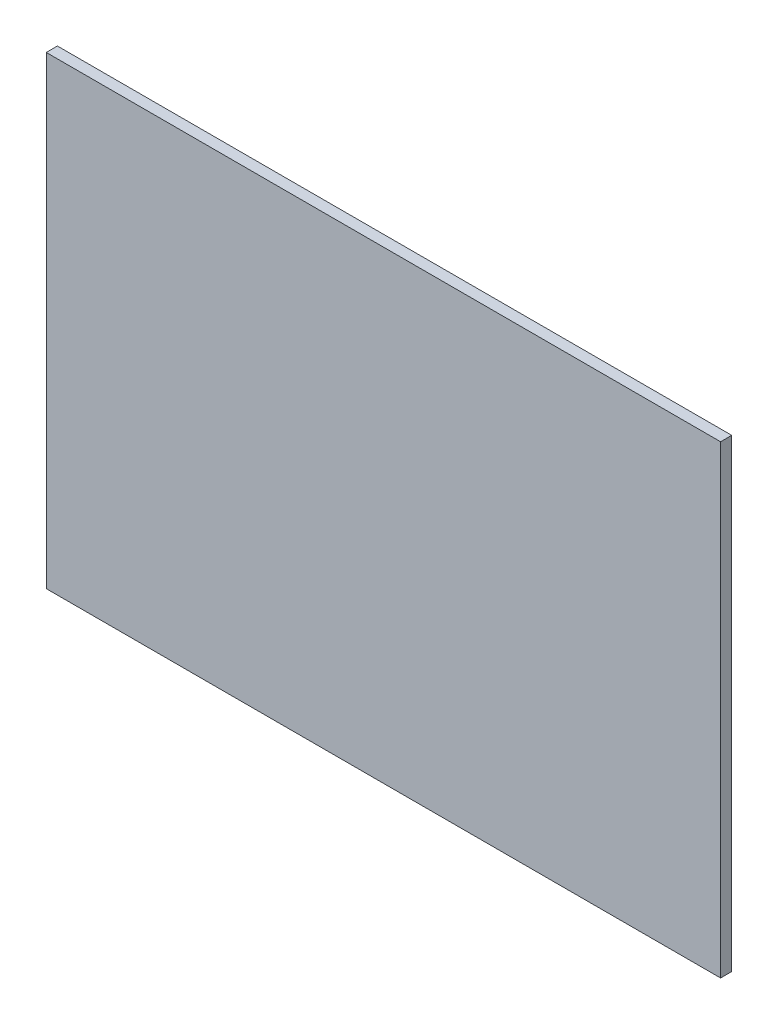
ISO-10303-21;
HEADER;
FILE_DESCRIPTION(('STEP AP214'),'2;1');
FILE_NAME('part.step','',(''),(''),'','','');
FILE_SCHEMA(('AUTOMOTIVE_DESIGN { 1 0 10303 214 1 1 1 1 }'));
ENDSEC;
DATA;
#1=APPLICATION_CONTEXT('core data for automotive mechanical design processes');
#2=APPLICATION_PROTOCOL_DEFINITION('international standard','automotive_design',2000,#1);
#3=PRODUCT_CONTEXT('',#1,'mechanical');
#4=PRODUCT('Part','Part','',(#3));
#5=PRODUCT_RELATED_PRODUCT_CATEGORY('part','',(#4));
#6=PRODUCT_DEFINITION_FORMATION('','',#4);
#7=PRODUCT_DEFINITION_CONTEXT('part definition',#1,'design');
#8=PRODUCT_DEFINITION('design','',#6,#7);
#9=PRODUCT_DEFINITION_SHAPE('','',#8);
#10=(LENGTH_UNIT() NAMED_UNIT(*) SI_UNIT(.MILLI.,.METRE.));
#11=(NAMED_UNIT(*) PLANE_ANGLE_UNIT() SI_UNIT($,.RADIAN.));
#12=(NAMED_UNIT(*) SI_UNIT($,.STERADIAN.) SOLID_ANGLE_UNIT());
#13=UNCERTAINTY_MEASURE_WITH_UNIT(LENGTH_MEASURE(1.E-05),#10,'distance_accuracy_value','');
#14=(GEOMETRIC_REPRESENTATION_CONTEXT(3) GLOBAL_UNCERTAINTY_ASSIGNED_CONTEXT((#13)) GLOBAL_UNIT_ASSIGNED_CONTEXT((#10,
#11,#12)) REPRESENTATION_CONTEXT('',''));
#15=CARTESIAN_POINT('',(0.,0.,0.));
#16=DIRECTION('',(0.,0.,1.));
#17=DIRECTION('',(1.,0.,0.));
#18=AXIS2_PLACEMENT_3D('',#15,#16,#17);
#19=CARTESIAN_POINT('',(363.,250.,12.));
#20=DIRECTION('',(-1.,0.,0.));
#21=DIRECTION('',(0.,-1.,0.));
#22=AXIS2_PLACEMENT_3D('',#19,#20,#21);
#23=PLANE('',#22);
#24=DIRECTION('',(0.,1.,0.));
#25=VECTOR('',#24,1.);
#26=CARTESIAN_POINT('',(363.,250.,0.));
#27=LINE('',#26,#25);
#28=CARTESIAN_POINT('',(363.,-250.,0.));
#29=VERTEX_POINT('',#28);
#30=CARTESIAN_POINT('',(363.,250.,0.));
#31=VERTEX_POINT('',#30);
#32=EDGE_CURVE('E96',#29,#31,#27,.T.);
#33=ORIENTED_EDGE('',*,*,#32,.T.);
#34=DIRECTION('',(0.,0.,-1.));
#35=VECTOR('',#34,1.);
#36=CARTESIAN_POINT('',(363.,250.,12.));
#37=LINE('',#36,#35);
#38=CARTESIAN_POINT('',(363.,250.,12.));
#39=VERTEX_POINT('',#38);
#40=EDGE_CURVE('E11',#39,#31,#37,.T.);
#41=ORIENTED_EDGE('',*,*,#40,.F.);
#42=DIRECTION('',(0.,1.,0.));
#43=VECTOR('',#42,1.);
#44=CARTESIAN_POINT('',(363.,250.,12.));
#45=LINE('',#44,#43);
#46=CARTESIAN_POINT('',(363.,-250.,12.));
#47=VERTEX_POINT('',#46);
#48=EDGE_CURVE('E84',#47,#39,#45,.T.);
#49=ORIENTED_EDGE('',*,*,#48,.F.);
#50=DIRECTION('',(0.,0.,-1.));
#51=VECTOR('',#50,1.);
#52=CARTESIAN_POINT('',(363.,-250.,12.));
#53=LINE('',#52,#51);
#54=EDGE_CURVE('E92',#47,#29,#53,.T.);
#55=ORIENTED_EDGE('',*,*,#54,.T.);
#56=EDGE_LOOP('',(#33,#41,#49,#55));
#57=FACE_BOUND('',#56,.T.);
#58=ADVANCED_FACE('F33',(#57),#23,.F.);
#59=CARTESIAN_POINT('',(-363.,250.,12.));
#60=DIRECTION('',(0.,-1.,0.));
#61=DIRECTION('',(0.,0.,-1.));
#62=AXIS2_PLACEMENT_3D('',#59,#60,#61);
#63=PLANE('',#62);
#64=DIRECTION('',(-1.,0.,0.));
#65=VECTOR('',#64,1.);
#66=CARTESIAN_POINT('',(-363.,250.,0.));
#67=LINE('',#66,#65);
#68=CARTESIAN_POINT('',(-363.,250.,0.));
#69=VERTEX_POINT('',#68);
#70=EDGE_CURVE('E88',#31,#69,#67,.T.);
#71=ORIENTED_EDGE('',*,*,#70,.T.);
#72=DIRECTION('',(0.,0.,-1.));
#73=VECTOR('',#72,1.);
#74=CARTESIAN_POINT('',(-363.,250.,12.));
#75=LINE('',#74,#73);
#76=CARTESIAN_POINT('',(-363.,250.,12.));
#77=VERTEX_POINT('',#76);
#78=EDGE_CURVE('E41',#77,#69,#75,.T.);
#79=ORIENTED_EDGE('',*,*,#78,.F.);
#80=DIRECTION('',(-1.,0.,0.));
#81=VECTOR('',#80,1.);
#82=CARTESIAN_POINT('',(-363.,250.,12.));
#83=LINE('',#82,#81);
#84=EDGE_CURVE('E79',#39,#77,#83,.T.);
#85=ORIENTED_EDGE('',*,*,#84,.F.);
#86=ORIENTED_EDGE('',*,*,#40,.T.);
#87=EDGE_LOOP('',(#71,#79,#85,#86));
#88=FACE_BOUND('',#87,.T.);
#89=ADVANCED_FACE('F87',(#88),#63,.F.);
#90=CARTESIAN_POINT('',(-363.,250.,12.));
#91=DIRECTION('',(1.,0.,0.));
#92=DIRECTION('',(0.,1.,0.));
#93=AXIS2_PLACEMENT_3D('',#90,#91,#92);
#94=PLANE('',#93);
#95=DIRECTION('',(0.,-1.,0.));
#96=VECTOR('',#95,1.);
#97=CARTESIAN_POINT('',(-363.,250.,0.));
#98=LINE('',#97,#96);
#99=CARTESIAN_POINT('',(-363.,-250.,0.));
#100=VERTEX_POINT('',#99);
#101=EDGE_CURVE('E66',#69,#100,#98,.T.);
#102=ORIENTED_EDGE('',*,*,#101,.T.);
#103=DIRECTION('',(0.,0.,-1.));
#104=VECTOR('',#103,1.);
#105=CARTESIAN_POINT('',(-363.,-250.,12.));
#106=LINE('',#105,#104);
#107=CARTESIAN_POINT('',(-363.,-250.,12.));
#108=VERTEX_POINT('',#107);
#109=EDGE_CURVE('E89',#108,#100,#106,.T.);
#110=ORIENTED_EDGE('',*,*,#109,.F.);
#111=DIRECTION('',(0.,-1.,0.));
#112=VECTOR('',#111,1.);
#113=CARTESIAN_POINT('',(-363.,250.,12.));
#114=LINE('',#113,#112);
#115=EDGE_CURVE('E82',#77,#108,#114,.T.);
#116=ORIENTED_EDGE('',*,*,#115,.F.);
#117=ORIENTED_EDGE('',*,*,#78,.T.);
#118=EDGE_LOOP('',(#102,#110,#116,#117));
#119=FACE_BOUND('',#118,.T.);
#120=ADVANCED_FACE('F90',(#119),#94,.F.);
#121=CARTESIAN_POINT('',(-363.,-250.,12.));
#122=DIRECTION('',(0.,1.,0.));
#123=DIRECTION('',(0.,0.,1.));
#124=AXIS2_PLACEMENT_3D('',#121,#122,#123);
#125=PLANE('',#124);
#126=DIRECTION('',(1.,0.,0.));
#127=VECTOR('',#126,1.);
#128=CARTESIAN_POINT('',(-363.,-250.,0.));
#129=LINE('',#128,#127);
#130=EDGE_CURVE('E72',#100,#29,#129,.T.);
#131=ORIENTED_EDGE('',*,*,#130,.T.);
#132=ORIENTED_EDGE('',*,*,#54,.F.);
#133=DIRECTION('',(1.,0.,0.));
#134=VECTOR('',#133,1.);
#135=CARTESIAN_POINT('',(-363.,-250.,12.));
#136=LINE('',#135,#134);
#137=EDGE_CURVE('E49',#108,#47,#136,.T.);
#138=ORIENTED_EDGE('',*,*,#137,.F.);
#139=ORIENTED_EDGE('',*,*,#109,.T.);
#140=EDGE_LOOP('',(#131,#132,#138,#139));
#141=FACE_BOUND('',#140,.T.);
#142=ADVANCED_FACE('F103',(#141),#125,.F.);
#143=CARTESIAN_POINT('',(0.,0.,12.));
#144=DIRECTION('',(0.,0.,1.));
#145=DIRECTION('',(1.,0.,0.));
#146=AXIS2_PLACEMENT_3D('',#143,#144,#145);
#147=PLANE('',#146);
#148=ORIENTED_EDGE('',*,*,#48,.T.);
#149=ORIENTED_EDGE('',*,*,#84,.T.);
#150=ORIENTED_EDGE('',*,*,#115,.T.);
#151=ORIENTED_EDGE('',*,*,#137,.T.);
#152=EDGE_LOOP('',(#148,#149,#150,#151));
#153=FACE_BOUND('',#152,.T.);
#154=ADVANCED_FACE('F80',(#153),#147,.T.);
#155=CARTESIAN_POINT('',(0.,0.,0.));
#156=DIRECTION('',(0.,0.,1.));
#157=DIRECTION('',(1.,0.,0.));
#158=AXIS2_PLACEMENT_3D('',#155,#156,#157);
#159=PLANE('',#158);
#160=ORIENTED_EDGE('',*,*,#32,.F.);
#161=ORIENTED_EDGE('',*,*,#130,.F.);
#162=ORIENTED_EDGE('',*,*,#101,.F.);
#163=ORIENTED_EDGE('',*,*,#70,.F.);
#164=EDGE_LOOP('',(#160,#161,#162,#163));
#165=FACE_BOUND('',#164,.T.);
#166=ADVANCED_FACE('F106',(#165),#159,.F.);
#167=CLOSED_SHELL('',(#58,#89,#120,#142,#154,#166));
#168=MANIFOLD_SOLID_BREP('B2',#167);
#169=ADVANCED_BREP_SHAPE_REPRESENTATION('',(#18,#168),#14);
#170=SHAPE_DEFINITION_REPRESENTATION(#9,#169);
ENDSEC;
END-ISO-10303-21;
